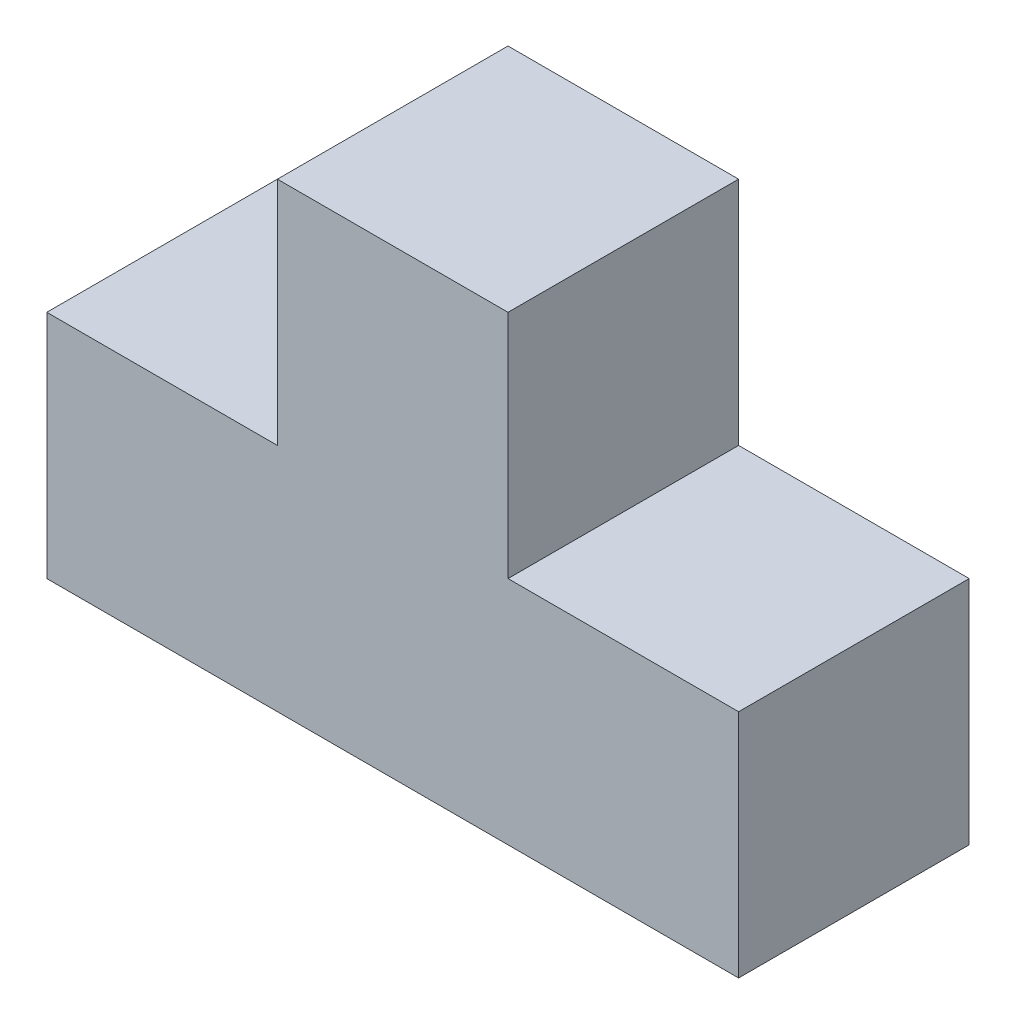
ISO-10303-21;
HEADER;
FILE_DESCRIPTION(('STEP AP214'),'2;1');
FILE_NAME('part.step','',(''),(''),'','','');
FILE_SCHEMA(('AUTOMOTIVE_DESIGN { 1 0 10303 214 1 1 1 1 }'));
ENDSEC;
DATA;
#1=APPLICATION_CONTEXT('core data for automotive mechanical design processes');
#2=APPLICATION_PROTOCOL_DEFINITION('international standard','automotive_design',2000,#1);
#3=PRODUCT_CONTEXT('',#1,'mechanical');
#4=PRODUCT('Part','Part','',(#3));
#5=PRODUCT_RELATED_PRODUCT_CATEGORY('part','',(#4));
#6=PRODUCT_DEFINITION_FORMATION('','',#4);
#7=PRODUCT_DEFINITION_CONTEXT('part definition',#1,'design');
#8=PRODUCT_DEFINITION('design','',#6,#7);
#9=PRODUCT_DEFINITION_SHAPE('','',#8);
#10=(LENGTH_UNIT() NAMED_UNIT(*) SI_UNIT(.MILLI.,.METRE.));
#11=(NAMED_UNIT(*) PLANE_ANGLE_UNIT() SI_UNIT($,.RADIAN.));
#12=(NAMED_UNIT(*) SI_UNIT($,.STERADIAN.) SOLID_ANGLE_UNIT());
#13=UNCERTAINTY_MEASURE_WITH_UNIT(LENGTH_MEASURE(1.E-05),#10,'distance_accuracy_value','');
#14=(GEOMETRIC_REPRESENTATION_CONTEXT(3) GLOBAL_UNCERTAINTY_ASSIGNED_CONTEXT((#13)) GLOBAL_UNIT_ASSIGNED_CONTEXT((#10,
#11,#12)) REPRESENTATION_CONTEXT('',''));
#15=CARTESIAN_POINT('',(0.,0.,0.));
#16=DIRECTION('',(0.,0.,1.));
#17=DIRECTION('',(1.,0.,0.));
#18=AXIS2_PLACEMENT_3D('',#15,#16,#17);
#19=CARTESIAN_POINT('',(1.11022302462516E-13,300.,300.));
#20=DIRECTION('',(1.,0.,0.));
#21=DIRECTION('',(0.,1.,0.));
#22=AXIS2_PLACEMENT_3D('',#19,#20,#21);
#23=PLANE('',#22);
#24=DIRECTION('',(0.,-1.,0.));
#25=VECTOR('',#24,1.);
#26=CARTESIAN_POINT('',(1.11022302462516E-13,300.,0.));
#27=LINE('',#26,#25);
#28=CARTESIAN_POINT('',(1.11022302462516E-13,300.,0.));
#29=VERTEX_POINT('',#28);
#30=CARTESIAN_POINT('',(0.,0.,0.));
#31=VERTEX_POINT('',#30);
#32=EDGE_CURVE('E140',#29,#31,#27,.T.);
#33=ORIENTED_EDGE('',*,*,#32,.T.);
#34=DIRECTION('',(0.,0.,-1.));
#35=VECTOR('',#34,1.);
#36=CARTESIAN_POINT('',(0.,0.,300.));
#37=LINE('',#36,#35);
#38=CARTESIAN_POINT('',(0.,0.,300.));
#39=VERTEX_POINT('',#38);
#40=EDGE_CURVE('E11',#39,#31,#37,.T.);
#41=ORIENTED_EDGE('',*,*,#40,.F.);
#42=DIRECTION('',(0.,-1.,0.));
#43=VECTOR('',#42,1.);
#44=CARTESIAN_POINT('',(1.11022302462516E-13,300.,300.));
#45=LINE('',#44,#43);
#46=CARTESIAN_POINT('',(1.11022302462516E-13,300.,300.));
#47=VERTEX_POINT('',#46);
#48=EDGE_CURVE('E162',#47,#39,#45,.T.);
#49=ORIENTED_EDGE('',*,*,#48,.F.);
#50=DIRECTION('',(0.,0.,-1.));
#51=VECTOR('',#50,1.);
#52=CARTESIAN_POINT('',(1.11022302462516E-13,300.,300.));
#53=LINE('',#52,#51);
#54=EDGE_CURVE('E136',#47,#29,#53,.T.);
#55=ORIENTED_EDGE('',*,*,#54,.T.);
#56=EDGE_LOOP('',(#33,#41,#49,#55));
#57=FACE_BOUND('',#56,.T.);
#58=ADVANCED_FACE('F39',(#57),#23,.F.);
#59=CARTESIAN_POINT('',(0.,0.,300.));
#60=DIRECTION('',(0.,1.,0.));
#61=DIRECTION('',(0.,0.,1.));
#62=AXIS2_PLACEMENT_3D('',#59,#60,#61);
#63=PLANE('',#62);
#64=DIRECTION('',(1.,0.,0.));
#65=VECTOR('',#64,1.);
#66=CARTESIAN_POINT('',(0.,0.,0.));
#67=LINE('',#66,#65);
#68=CARTESIAN_POINT('',(900.,0.,0.));
#69=VERTEX_POINT('',#68);
#70=EDGE_CURVE('E144',#31,#69,#67,.T.);
#71=ORIENTED_EDGE('',*,*,#70,.T.);
#72=DIRECTION('',(0.,0.,-1.));
#73=VECTOR('',#72,1.);
#74=CARTESIAN_POINT('',(900.,0.,300.));
#75=LINE('',#74,#73);
#76=CARTESIAN_POINT('',(900.,0.,300.));
#77=VERTEX_POINT('',#76);
#78=EDGE_CURVE('E48',#77,#69,#75,.T.);
#79=ORIENTED_EDGE('',*,*,#78,.F.);
#80=DIRECTION('',(1.,0.,0.));
#81=VECTOR('',#80,1.);
#82=CARTESIAN_POINT('',(0.,0.,300.));
#83=LINE('',#82,#81);
#84=EDGE_CURVE('E99',#39,#77,#83,.T.);
#85=ORIENTED_EDGE('',*,*,#84,.F.);
#86=ORIENTED_EDGE('',*,*,#40,.T.);
#87=EDGE_LOOP('',(#71,#79,#85,#86));
#88=FACE_BOUND('',#87,.T.);
#89=ADVANCED_FACE('F208',(#88),#63,.F.);
#90=CARTESIAN_POINT('',(900.,0.,300.));
#91=DIRECTION('',(-1.,0.,0.));
#92=DIRECTION('',(0.,-1.,0.));
#93=AXIS2_PLACEMENT_3D('',#90,#91,#92);
#94=PLANE('',#93);
#95=DIRECTION('',(0.,1.,0.));
#96=VECTOR('',#95,1.);
#97=CARTESIAN_POINT('',(900.,0.,0.));
#98=LINE('',#97,#96);
#99=CARTESIAN_POINT('',(900.,300.,0.));
#100=VERTEX_POINT('',#99);
#101=EDGE_CURVE('E147',#69,#100,#98,.T.);
#102=ORIENTED_EDGE('',*,*,#101,.T.);
#103=DIRECTION('',(0.,0.,-1.));
#104=VECTOR('',#103,1.);
#105=CARTESIAN_POINT('',(900.,300.,300.));
#106=LINE('',#105,#104);
#107=CARTESIAN_POINT('',(900.,300.,300.));
#108=VERTEX_POINT('',#107);
#109=EDGE_CURVE('E173',#108,#100,#106,.T.);
#110=ORIENTED_EDGE('',*,*,#109,.F.);
#111=DIRECTION('',(0.,1.,0.));
#112=VECTOR('',#111,1.);
#113=CARTESIAN_POINT('',(900.,0.,300.));
#114=LINE('',#113,#112);
#115=EDGE_CURVE('E183',#77,#108,#114,.T.);
#116=ORIENTED_EDGE('',*,*,#115,.F.);
#117=ORIENTED_EDGE('',*,*,#78,.T.);
#118=EDGE_LOOP('',(#102,#110,#116,#117));
#119=FACE_BOUND('',#118,.T.);
#120=ADVANCED_FACE('F181',(#119),#94,.F.);
#121=CARTESIAN_POINT('',(900.,300.,300.));
#122=DIRECTION('',(0.,-1.,0.));
#123=DIRECTION('',(0.,0.,-1.));
#124=AXIS2_PLACEMENT_3D('',#121,#122,#123);
#125=PLANE('',#124);
#126=DIRECTION('',(-1.,0.,0.));
#127=VECTOR('',#126,1.);
#128=CARTESIAN_POINT('',(900.,300.,0.));
#129=LINE('',#128,#127);
#130=CARTESIAN_POINT('',(600.,300.,0.));
#131=VERTEX_POINT('',#130);
#132=EDGE_CURVE('E150',#100,#131,#129,.T.);
#133=ORIENTED_EDGE('',*,*,#132,.T.);
#134=DIRECTION('',(0.,0.,-1.));
#135=VECTOR('',#134,1.);
#136=CARTESIAN_POINT('',(600.,300.,300.));
#137=LINE('',#136,#135);
#138=CARTESIAN_POINT('',(600.,300.,300.));
#139=VERTEX_POINT('',#138);
#140=EDGE_CURVE('E169',#139,#131,#137,.T.);
#141=ORIENTED_EDGE('',*,*,#140,.F.);
#142=DIRECTION('',(-1.,0.,0.));
#143=VECTOR('',#142,1.);
#144=CARTESIAN_POINT('',(900.,300.,300.));
#145=LINE('',#144,#143);
#146=EDGE_CURVE('E196',#108,#139,#145,.T.);
#147=ORIENTED_EDGE('',*,*,#146,.F.);
#148=ORIENTED_EDGE('',*,*,#109,.T.);
#149=EDGE_LOOP('',(#133,#141,#147,#148));
#150=FACE_BOUND('',#149,.T.);
#151=ADVANCED_FACE('F191',(#150),#125,.F.);
#152=CARTESIAN_POINT('',(600.,300.,300.));
#153=DIRECTION('',(-1.,0.,0.));
#154=DIRECTION('',(0.,0.,1.));
#155=AXIS2_PLACEMENT_3D('',#152,#153,#154);
#156=PLANE('',#155);
#157=DIRECTION('',(0.,1.,0.));
#158=VECTOR('',#157,1.);
#159=CARTESIAN_POINT('',(600.,300.,0.));
#160=LINE('',#159,#158);
#161=CARTESIAN_POINT('',(600.,600.,0.));
#162=VERTEX_POINT('',#161);
#163=EDGE_CURVE('E153',#131,#162,#160,.T.);
#164=ORIENTED_EDGE('',*,*,#163,.T.);
#165=DIRECTION('',(0.,0.,-1.));
#166=VECTOR('',#165,1.);
#167=CARTESIAN_POINT('',(600.,600.,300.));
#168=LINE('',#167,#166);
#169=CARTESIAN_POINT('',(600.,600.,300.));
#170=VERTEX_POINT('',#169);
#171=EDGE_CURVE('E129',#170,#162,#168,.T.);
#172=ORIENTED_EDGE('',*,*,#171,.F.);
#173=DIRECTION('',(0.,1.,0.));
#174=VECTOR('',#173,1.);
#175=CARTESIAN_POINT('',(600.,300.,300.));
#176=LINE('',#175,#174);
#177=EDGE_CURVE('E118',#139,#170,#176,.T.);
#178=ORIENTED_EDGE('',*,*,#177,.F.);
#179=ORIENTED_EDGE('',*,*,#140,.T.);
#180=EDGE_LOOP('',(#164,#172,#178,#179));
#181=FACE_BOUND('',#180,.T.);
#182=ADVANCED_FACE('F194',(#181),#156,.F.);
#183=CARTESIAN_POINT('',(600.,600.,300.));
#184=DIRECTION('',(0.,-1.,0.));
#185=DIRECTION('',(0.,0.,-1.));
#186=AXIS2_PLACEMENT_3D('',#183,#184,#185);
#187=PLANE('',#186);
#188=DIRECTION('',(-1.,0.,0.));
#189=VECTOR('',#188,1.);
#190=CARTESIAN_POINT('',(600.,600.,0.));
#191=LINE('',#190,#189);
#192=CARTESIAN_POINT('',(300.,600.,0.));
#193=VERTEX_POINT('',#192);
#194=EDGE_CURVE('E127',#162,#193,#191,.T.);
#195=ORIENTED_EDGE('',*,*,#194,.T.);
#196=DIRECTION('',(0.,0.,-1.));
#197=VECTOR('',#196,1.);
#198=CARTESIAN_POINT('',(300.,600.,300.));
#199=LINE('',#198,#197);
#200=CARTESIAN_POINT('',(300.,600.,300.));
#201=VERTEX_POINT('',#200);
#202=EDGE_CURVE('E124',#201,#193,#199,.T.);
#203=ORIENTED_EDGE('',*,*,#202,.F.);
#204=DIRECTION('',(-1.,0.,0.));
#205=VECTOR('',#204,1.);
#206=CARTESIAN_POINT('',(600.,600.,300.));
#207=LINE('',#206,#205);
#208=EDGE_CURVE('E112',#170,#201,#207,.T.);
#209=ORIENTED_EDGE('',*,*,#208,.F.);
#210=ORIENTED_EDGE('',*,*,#171,.T.);
#211=EDGE_LOOP('',(#195,#203,#209,#210));
#212=FACE_BOUND('',#211,.T.);
#213=ADVANCED_FACE('F125',(#212),#187,.F.);
#214=CARTESIAN_POINT('',(300.,600.,300.));
#215=DIRECTION('',(1.,0.,0.));
#216=DIRECTION('',(0.,1.,0.));
#217=AXIS2_PLACEMENT_3D('',#214,#215,#216);
#218=PLANE('',#217);
#219=DIRECTION('',(0.,-1.,0.));
#220=VECTOR('',#219,1.);
#221=CARTESIAN_POINT('',(300.,600.,0.));
#222=LINE('',#221,#220);
#223=CARTESIAN_POINT('',(300.,300.,0.));
#224=VERTEX_POINT('',#223);
#225=EDGE_CURVE('E85',#193,#224,#222,.T.);
#226=ORIENTED_EDGE('',*,*,#225,.T.);
#227=DIRECTION('',(0.,0.,-1.));
#228=VECTOR('',#227,1.);
#229=CARTESIAN_POINT('',(300.,300.,300.));
#230=LINE('',#229,#228);
#231=CARTESIAN_POINT('',(300.,300.,300.));
#232=VERTEX_POINT('',#231);
#233=EDGE_CURVE('E130',#232,#224,#230,.T.);
#234=ORIENTED_EDGE('',*,*,#233,.F.);
#235=DIRECTION('',(0.,-1.,0.));
#236=VECTOR('',#235,1.);
#237=CARTESIAN_POINT('',(300.,600.,300.));
#238=LINE('',#237,#236);
#239=EDGE_CURVE('E116',#201,#232,#238,.T.);
#240=ORIENTED_EDGE('',*,*,#239,.F.);
#241=ORIENTED_EDGE('',*,*,#202,.T.);
#242=EDGE_LOOP('',(#226,#234,#240,#241));
#243=FACE_BOUND('',#242,.T.);
#244=ADVANCED_FACE('F132',(#243),#218,.F.);
#245=CARTESIAN_POINT('',(300.,300.,300.));
#246=DIRECTION('',(0.,-1.,0.));
#247=DIRECTION('',(0.,0.,-1.));
#248=AXIS2_PLACEMENT_3D('',#245,#246,#247);
#249=PLANE('',#248);
#250=DIRECTION('',(-1.,0.,0.));
#251=VECTOR('',#250,1.);
#252=CARTESIAN_POINT('',(300.,300.,0.));
#253=LINE('',#252,#251);
#254=EDGE_CURVE('E91',#224,#29,#253,.T.);
#255=ORIENTED_EDGE('',*,*,#254,.T.);
#256=ORIENTED_EDGE('',*,*,#54,.F.);
#257=DIRECTION('',(-1.,0.,0.));
#258=VECTOR('',#257,1.);
#259=CARTESIAN_POINT('',(300.,300.,300.));
#260=LINE('',#259,#258);
#261=EDGE_CURVE('E56',#232,#47,#260,.T.);
#262=ORIENTED_EDGE('',*,*,#261,.F.);
#263=ORIENTED_EDGE('',*,*,#233,.T.);
#264=EDGE_LOOP('',(#255,#256,#262,#263));
#265=FACE_BOUND('',#264,.T.);
#266=ADVANCED_FACE('F224',(#265),#249,.F.);
#267=CARTESIAN_POINT('',(0.,0.,300.));
#268=DIRECTION('',(0.,0.,1.));
#269=DIRECTION('',(1.,0.,0.));
#270=AXIS2_PLACEMENT_3D('',#267,#268,#269);
#271=PLANE('',#270);
#272=ORIENTED_EDGE('',*,*,#48,.T.);
#273=ORIENTED_EDGE('',*,*,#84,.T.);
#274=ORIENTED_EDGE('',*,*,#115,.T.);
#275=ORIENTED_EDGE('',*,*,#146,.T.);
#276=ORIENTED_EDGE('',*,*,#177,.T.);
#277=ORIENTED_EDGE('',*,*,#208,.T.);
#278=ORIENTED_EDGE('',*,*,#239,.T.);
#279=ORIENTED_EDGE('',*,*,#261,.T.);
#280=EDGE_LOOP('',(#272,#273,#274,#275,#276,#277,#278,#279));
#281=FACE_BOUND('',#280,.T.);
#282=ADVANCED_FACE('F114',(#281),#271,.T.);
#283=CARTESIAN_POINT('',(0.,0.,0.));
#284=DIRECTION('',(0.,0.,1.));
#285=DIRECTION('',(1.,0.,0.));
#286=AXIS2_PLACEMENT_3D('',#283,#284,#285);
#287=PLANE('',#286);
#288=ORIENTED_EDGE('',*,*,#32,.F.);
#289=ORIENTED_EDGE('',*,*,#254,.F.);
#290=ORIENTED_EDGE('',*,*,#225,.F.);
#291=ORIENTED_EDGE('',*,*,#194,.F.);
#292=ORIENTED_EDGE('',*,*,#163,.F.);
#293=ORIENTED_EDGE('',*,*,#132,.F.);
#294=ORIENTED_EDGE('',*,*,#101,.F.);
#295=ORIENTED_EDGE('',*,*,#70,.F.);
#296=EDGE_LOOP('',(#288,#289,#290,#291,#292,#293,#294,#295));
#297=FACE_BOUND('',#296,.T.);
#298=ADVANCED_FACE('F187',(#297),#287,.F.);
#299=CLOSED_SHELL('',(#58,#89,#120,#151,#182,#213,#244,#266,#282,#298));
#300=MANIFOLD_SOLID_BREP('B2',#299);
#301=ADVANCED_BREP_SHAPE_REPRESENTATION('',(#18,#300),#14);
#302=SHAPE_DEFINITION_REPRESENTATION(#9,#301);
ENDSEC;
END-ISO-10303-21;
